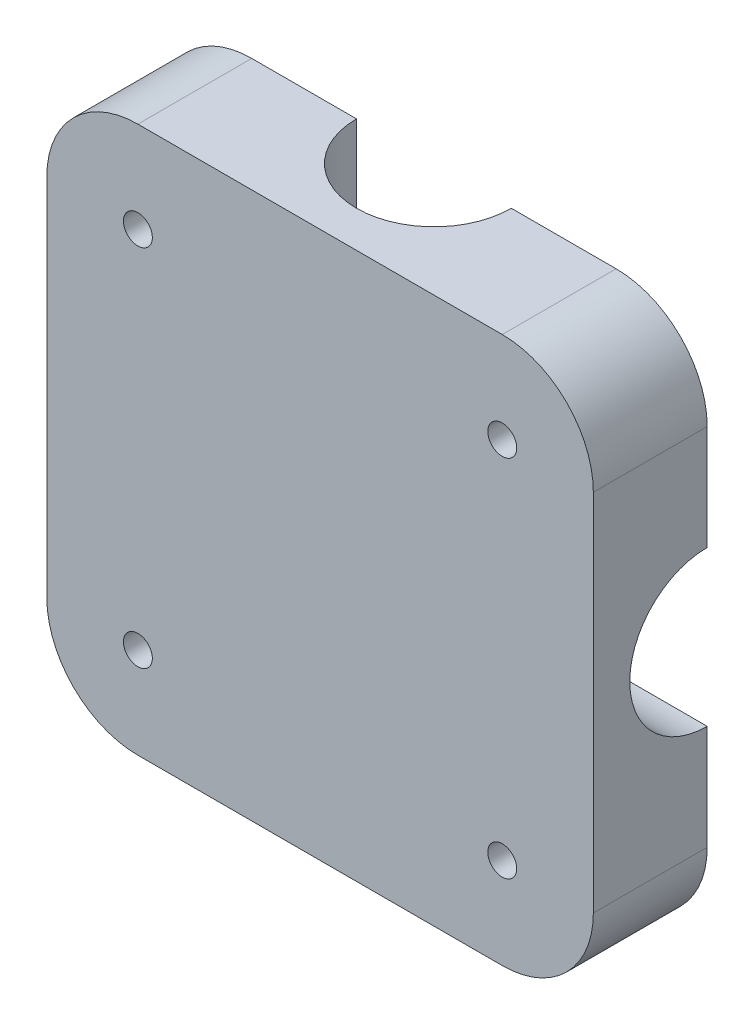
ISO-10303-21;
HEADER;
FILE_DESCRIPTION(('STEP AP214'),'2;1');
FILE_NAME('part.step','',(''),(''),'','','');
FILE_SCHEMA(('AUTOMOTIVE_DESIGN { 1 0 10303 214 1 1 1 1 }'));
ENDSEC;
DATA;
#1=APPLICATION_CONTEXT('core data for automotive mechanical design processes');
#2=APPLICATION_PROTOCOL_DEFINITION('international standard','automotive_design',2000,#1);
#3=PRODUCT_CONTEXT('',#1,'mechanical');
#4=PRODUCT('Part','Part','',(#3));
#5=PRODUCT_RELATED_PRODUCT_CATEGORY('part','',(#4));
#6=PRODUCT_DEFINITION_FORMATION('','',#4);
#7=PRODUCT_DEFINITION_CONTEXT('part definition',#1,'design');
#8=PRODUCT_DEFINITION('design','',#6,#7);
#9=PRODUCT_DEFINITION_SHAPE('','',#8);
#10=(LENGTH_UNIT() NAMED_UNIT(*) SI_UNIT(.MILLI.,.METRE.));
#11=(NAMED_UNIT(*) PLANE_ANGLE_UNIT() SI_UNIT($,.RADIAN.));
#12=(NAMED_UNIT(*) SI_UNIT($,.STERADIAN.) SOLID_ANGLE_UNIT());
#13=UNCERTAINTY_MEASURE_WITH_UNIT(LENGTH_MEASURE(1.E-05),#10,'distance_accuracy_value','');
#14=(GEOMETRIC_REPRESENTATION_CONTEXT(3) GLOBAL_UNCERTAINTY_ASSIGNED_CONTEXT((#13)) GLOBAL_UNIT_ASSIGNED_CONTEXT((#10,
#11,#12)) REPRESENTATION_CONTEXT('',''));
#15=CARTESIAN_POINT('',(0.,0.,0.));
#16=DIRECTION('',(0.,0.,1.));
#17=DIRECTION('',(1.,0.,0.));
#18=AXIS2_PLACEMENT_3D('',#15,#16,#17);
#19=CARTESIAN_POINT('',(20.,20.,0.));
#20=DIRECTION('',(0.,0.,-1.));
#21=DIRECTION('',(-1.,0.,0.));
#22=AXIS2_PLACEMENT_3D('',#19,#20,#21);
#23=PLANE('',#22);
#24=CARTESIAN_POINT('',(-19.9999999999996,-20.,0.));
#25=DIRECTION('',(0.,0.,-1.));
#26=DIRECTION('',(-1.,0.,0.));
#27=AXIS2_PLACEMENT_3D('',#24,#25,#26);
#28=CIRCLE('',#27,1.5875);
#29=CARTESIAN_POINT('',(-21.5874999999996,-20.,0.));
#30=VERTEX_POINT('',#29);
#31=EDGE_CURVE('E148',#30,#30,#28,.T.);
#32=ORIENTED_EDGE('',*,*,#31,.F.);
#33=EDGE_LOOP('',(#32));
#34=FACE_BOUND('',#33,.T.);
#35=DIRECTION('',(-1.,0.,0.));
#36=VECTOR('',#35,1.);
#37=CARTESIAN_POINT('',(52.5,-8.5,0.));
#38=LINE('',#37,#36);
#39=CARTESIAN_POINT('',(-8.5,-8.5,0.));
#40=VERTEX_POINT('',#39);
#41=CARTESIAN_POINT('',(-30.,-8.5,0.));
#42=VERTEX_POINT('',#41);
#43=EDGE_CURVE('E143',#40,#42,#38,.T.);
#44=ORIENTED_EDGE('',*,*,#43,.F.);
#45=DIRECTION('',(0.,1.,0.));
#46=VECTOR('',#45,1.);
#47=CARTESIAN_POINT('',(-8.5,-41.25,0.));
#48=LINE('',#47,#46);
#49=CARTESIAN_POINT('',(-8.5,-30.,0.));
#50=VERTEX_POINT('',#49);
#51=EDGE_CURVE('E211',#50,#40,#48,.T.);
#52=ORIENTED_EDGE('',*,*,#51,.F.);
#53=DIRECTION('',(1.,0.,0.));
#54=VECTOR('',#53,1.);
#55=CARTESIAN_POINT('',(-19.9999999999999,-30.,0.));
#56=LINE('',#55,#54);
#57=CARTESIAN_POINT('',(-19.9999999999999,-30.,0.));
#58=VERTEX_POINT('',#57);
#59=EDGE_CURVE('E175',#58,#50,#56,.T.);
#60=ORIENTED_EDGE('',*,*,#59,.F.);
#61=CARTESIAN_POINT('',(-20.,-20.,0.));
#62=DIRECTION('',(0.,0.,1.));
#63=DIRECTION('',(-1.,0.,0.));
#64=AXIS2_PLACEMENT_3D('',#61,#62,#63);
#65=CIRCLE('',#64,10.);
#66=CARTESIAN_POINT('',(-30.,-19.9999999999999,0.));
#67=VERTEX_POINT('',#66);
#68=EDGE_CURVE('E166',#67,#58,#65,.T.);
#69=ORIENTED_EDGE('',*,*,#68,.F.);
#70=DIRECTION('',(0.,-1.,0.));
#71=VECTOR('',#70,1.);
#72=CARTESIAN_POINT('',(-30.,-19.9999999999999,0.));
#73=LINE('',#72,#71);
#74=EDGE_CURVE('E167',#42,#67,#73,.T.);
#75=ORIENTED_EDGE('',*,*,#74,.F.);
#76=EDGE_LOOP('',(#44,#52,#60,#69,#75));
#77=FACE_BOUND('',#76,.T.);
#78=ADVANCED_FACE('F35',(#34,#77),#23,.T.);
#79=CARTESIAN_POINT('',(20.0000000000004,-19.9999999999994,0.));
#80=DIRECTION('',(0.,0.,-1.));
#81=DIRECTION('',(-1.,0.,0.));
#82=AXIS2_PLACEMENT_3D('',#79,#80,#81);
#83=CIRCLE('',#82,1.5875);
#84=CARTESIAN_POINT('',(18.4125000000004,-19.9999999999994,0.));
#85=VERTEX_POINT('',#84);
#86=EDGE_CURVE('E284',#85,#85,#83,.T.);
#87=ORIENTED_EDGE('',*,*,#86,.F.);
#88=EDGE_LOOP('',(#87));
#89=FACE_BOUND('',#88,.T.);
#90=DIRECTION('',(-1.,0.,0.));
#91=VECTOR('',#90,1.);
#92=CARTESIAN_POINT('',(52.5,-8.5,0.));
#93=LINE('',#92,#91);
#94=CARTESIAN_POINT('',(30.,-8.5,0.));
#95=VERTEX_POINT('',#94);
#96=CARTESIAN_POINT('',(8.5,-8.5,0.));
#97=VERTEX_POINT('',#96);
#98=EDGE_CURVE('E147',#95,#97,#93,.T.);
#99=ORIENTED_EDGE('',*,*,#98,.F.);
#100=DIRECTION('',(0.,1.,0.));
#101=VECTOR('',#100,1.);
#102=CARTESIAN_POINT('',(30.,-19.9999999999999,0.));
#103=LINE('',#102,#101);
#104=CARTESIAN_POINT('',(30.,-20.,0.));
#105=VERTEX_POINT('',#104);
#106=EDGE_CURVE('E181',#105,#95,#103,.T.);
#107=ORIENTED_EDGE('',*,*,#106,.F.);
#108=CARTESIAN_POINT('',(20.,-20.,0.));
#109=DIRECTION('',(0.,0.,1.));
#110=DIRECTION('',(1.,0.,0.));
#111=AXIS2_PLACEMENT_3D('',#108,#109,#110);
#112=CIRCLE('',#111,10.);
#113=CARTESIAN_POINT('',(19.9999999999999,-30.,0.));
#114=VERTEX_POINT('',#113);
#115=EDGE_CURVE('E178',#114,#105,#112,.T.);
#116=ORIENTED_EDGE('',*,*,#115,.F.);
#117=CARTESIAN_POINT('',(8.5,-30.,0.));
#118=VERTEX_POINT('',#117);
#119=EDGE_CURVE('E169',#118,#114,#56,.T.);
#120=ORIENTED_EDGE('',*,*,#119,.F.);
#121=DIRECTION('',(0.,1.,0.));
#122=VECTOR('',#121,1.);
#123=CARTESIAN_POINT('',(8.5,-41.25,0.));
#124=LINE('',#123,#122);
#125=EDGE_CURVE('E208',#97,#118,#124,.F.);
#126=ORIENTED_EDGE('',*,*,#125,.F.);
#127=EDGE_LOOP('',(#99,#107,#116,#120,#126));
#128=FACE_BOUND('',#127,.T.);
#129=ADVANCED_FACE('F329',(#89,#128),#23,.T.);
#130=CARTESIAN_POINT('',(0.,-41.25,0.));
#131=DIRECTION('',(0.,1.,0.));
#132=DIRECTION('',(0.,0.,1.));
#133=AXIS2_PLACEMENT_3D('',#130,#131,#132);
#134=CYLINDRICAL_SURFACE('',#133,8.5);
#135=CARTESIAN_POINT('',(8.49999999999999,30.,0.));
#136=VERTEX_POINT('',#135);
#137=CARTESIAN_POINT('',(8.49999999999999,8.5,0.));
#138=VERTEX_POINT('',#137);
#139=EDGE_CURVE('E209',#136,#138,#124,.F.);
#140=ORIENTED_EDGE('',*,*,#139,.T.);
#141=CARTESIAN_POINT('',(0.,0.,0.));
#142=DIRECTION('',(-0.707106781186547,0.707106781186547,0.));
#143=DIRECTION('',(0.707106781186547,0.707106781186547,0.));
#144=AXIS2_PLACEMENT_3D('',#141,#142,#143);
#145=ELLIPSE('',#144,12.0208152801713,8.5);
#146=CARTESIAN_POINT('',(0.,0.,8.5));
#147=VERTEX_POINT('',#146);
#148=EDGE_CURVE('E11',#138,#147,#145,.F.);
#149=ORIENTED_EDGE('',*,*,#148,.T.);
#150=CARTESIAN_POINT('',(0.,0.,0.));
#151=DIRECTION('',(0.707106781186547,0.707106781186547,0.));
#152=DIRECTION('',(-0.707106781186547,0.707106781186547,0.));
#153=AXIS2_PLACEMENT_3D('',#150,#151,#152);
#154=ELLIPSE('',#153,12.0208152801713,8.5);
#155=CARTESIAN_POINT('',(-8.5,8.5,0.));
#156=VERTEX_POINT('',#155);
#157=EDGE_CURVE('E214',#147,#156,#154,.F.);
#158=ORIENTED_EDGE('',*,*,#157,.T.);
#159=CARTESIAN_POINT('',(-8.5,30.,0.));
#160=VERTEX_POINT('',#159);
#161=EDGE_CURVE('E157',#156,#160,#48,.T.);
#162=ORIENTED_EDGE('',*,*,#161,.T.);
#163=CARTESIAN_POINT('',(0.,30.,0.));
#164=DIRECTION('',(0.,-1.,0.));
#165=DIRECTION('',(0.,0.,-1.));
#166=AXIS2_PLACEMENT_3D('',#163,#164,#165);
#167=CIRCLE('',#166,8.5);
#168=EDGE_CURVE('E59',#136,#160,#167,.T.);
#169=ORIENTED_EDGE('',*,*,#168,.F.);
#170=EDGE_LOOP('',(#140,#149,#158,#162,#169));
#171=FACE_BOUND('',#170,.T.);
#172=ADVANCED_FACE('F272',(#171),#134,.F.);
#173=CARTESIAN_POINT('',(-20.,20.,0.));
#174=DIRECTION('',(0.,0.,-1.));
#175=DIRECTION('',(-1.,0.,0.));
#176=AXIS2_PLACEMENT_3D('',#173,#174,#175);
#177=CIRCLE('',#176,1.5875);
#178=CARTESIAN_POINT('',(-21.5875,20.,0.));
#179=VERTEX_POINT('',#178);
#180=EDGE_CURVE('E287',#179,#179,#177,.T.);
#181=ORIENTED_EDGE('',*,*,#180,.F.);
#182=EDGE_LOOP('',(#181));
#183=FACE_BOUND('',#182,.T.);
#184=DIRECTION('',(-1.,0.,0.));
#185=VECTOR('',#184,1.);
#186=CARTESIAN_POINT('',(52.5,8.5,0.));
#187=LINE('',#186,#185);
#188=CARTESIAN_POINT('',(-30.,8.5,0.));
#189=VERTEX_POINT('',#188);
#190=EDGE_CURVE('E51',#189,#156,#187,.F.);
#191=ORIENTED_EDGE('',*,*,#190,.F.);
#192=CARTESIAN_POINT('',(-30.,19.9999999999999,0.));
#193=VERTEX_POINT('',#192);
#194=EDGE_CURVE('E155',#193,#189,#73,.T.);
#195=ORIENTED_EDGE('',*,*,#194,.F.);
#196=CARTESIAN_POINT('',(-20.,20.,0.));
#197=DIRECTION('',(0.,0.,1.));
#198=DIRECTION('',(-1.,0.,0.));
#199=AXIS2_PLACEMENT_3D('',#196,#197,#198);
#200=CIRCLE('',#199,10.);
#201=CARTESIAN_POINT('',(-19.9999999999999,30.,0.));
#202=VERTEX_POINT('',#201);
#203=EDGE_CURVE('E171',#202,#193,#200,.T.);
#204=ORIENTED_EDGE('',*,*,#203,.F.);
#205=DIRECTION('',(-1.,0.,0.));
#206=VECTOR('',#205,1.);
#207=CARTESIAN_POINT('',(-19.9999999999999,30.,0.));
#208=LINE('',#207,#206);
#209=EDGE_CURVE('E251',#160,#202,#208,.T.);
#210=ORIENTED_EDGE('',*,*,#209,.F.);
#211=ORIENTED_EDGE('',*,*,#161,.F.);
#212=EDGE_LOOP('',(#191,#195,#204,#210,#211));
#213=FACE_BOUND('',#212,.T.);
#214=ADVANCED_FACE('F153',(#183,#213),#23,.T.);
#215=CARTESIAN_POINT('',(20.,20.,12.5));
#216=DIRECTION('',(0.,0.,-1.));
#217=DIRECTION('',(-1.,0.,0.));
#218=AXIS2_PLACEMENT_3D('',#215,#216,#217);
#219=CYLINDRICAL_SURFACE('',#218,10.);
#220=CARTESIAN_POINT('',(20.,20.,0.));
#221=DIRECTION('',(0.,0.,1.));
#222=DIRECTION('',(-1.,0.,0.));
#223=AXIS2_PLACEMENT_3D('',#220,#221,#222);
#224=CIRCLE('',#223,10.);
#225=CARTESIAN_POINT('',(30.,19.9999999999999,0.));
#226=VERTEX_POINT('',#225);
#227=CARTESIAN_POINT('',(19.9999999999999,30.,0.));
#228=VERTEX_POINT('',#227);
#229=EDGE_CURVE('E234',#226,#228,#224,.T.);
#230=ORIENTED_EDGE('',*,*,#229,.T.);
#231=DIRECTION('',(0.,0.,-1.));
#232=VECTOR('',#231,1.);
#233=CARTESIAN_POINT('',(19.9999999999999,30.,12.5));
#234=LINE('',#233,#232);
#235=CARTESIAN_POINT('',(19.9999999999999,30.,12.5));
#236=VERTEX_POINT('',#235);
#237=EDGE_CURVE('E205',#236,#228,#234,.T.);
#238=ORIENTED_EDGE('',*,*,#237,.F.);
#239=CARTESIAN_POINT('',(20.,20.,12.5));
#240=DIRECTION('',(0.,0.,1.));
#241=DIRECTION('',(-1.,0.,0.));
#242=AXIS2_PLACEMENT_3D('',#239,#240,#241);
#243=CIRCLE('',#242,10.);
#244=CARTESIAN_POINT('',(30.,19.9999999999999,12.5));
#245=VERTEX_POINT('',#244);
#246=EDGE_CURVE('E184',#245,#236,#243,.T.);
#247=ORIENTED_EDGE('',*,*,#246,.F.);
#248=DIRECTION('',(0.,0.,-1.));
#249=VECTOR('',#248,1.);
#250=CARTESIAN_POINT('',(30.,19.9999999999999,12.5));
#251=LINE('',#250,#249);
#252=EDGE_CURVE('E185',#245,#226,#251,.T.);
#253=ORIENTED_EDGE('',*,*,#252,.T.);
#254=EDGE_LOOP('',(#230,#238,#247,#253));
#255=FACE_BOUND('',#254,.T.);
#256=ADVANCED_FACE('F37',(#255),#219,.T.);
#257=CARTESIAN_POINT('',(-19.9999999999999,30.,12.5));
#258=DIRECTION('',(0.,-1.,0.));
#259=DIRECTION('',(0.,0.,-1.));
#260=AXIS2_PLACEMENT_3D('',#257,#258,#259);
#261=PLANE('',#260);
#262=EDGE_CURVE('E252',#228,#136,#208,.T.);
#263=ORIENTED_EDGE('',*,*,#262,.T.);
#264=ORIENTED_EDGE('',*,*,#168,.T.);
#265=ORIENTED_EDGE('',*,*,#209,.T.);
#266=DIRECTION('',(0.,0.,-1.));
#267=VECTOR('',#266,1.);
#268=CARTESIAN_POINT('',(-19.9999999999999,30.,12.5));
#269=LINE('',#268,#267);
#270=CARTESIAN_POINT('',(-19.9999999999999,30.,12.5));
#271=VERTEX_POINT('',#270);
#272=EDGE_CURVE('E202',#271,#202,#269,.T.);
#273=ORIENTED_EDGE('',*,*,#272,.F.);
#274=DIRECTION('',(-1.,0.,0.));
#275=VECTOR('',#274,1.);
#276=CARTESIAN_POINT('',(-19.9999999999999,30.,12.5));
#277=LINE('',#276,#275);
#278=EDGE_CURVE('E237',#236,#271,#277,.T.);
#279=ORIENTED_EDGE('',*,*,#278,.F.);
#280=ORIENTED_EDGE('',*,*,#237,.T.);
#281=EDGE_LOOP('',(#263,#264,#265,#273,#279,#280));
#282=FACE_BOUND('',#281,.T.);
#283=ADVANCED_FACE('F256',(#282),#261,.F.);
#284=CARTESIAN_POINT('',(-20.,20.,12.5));
#285=DIRECTION('',(0.,0.,-1.));
#286=DIRECTION('',(-1.,0.,0.));
#287=AXIS2_PLACEMENT_3D('',#284,#285,#286);
#288=CYLINDRICAL_SURFACE('',#287,10.);
#289=ORIENTED_EDGE('',*,*,#203,.T.);
#290=DIRECTION('',(0.,0.,-1.));
#291=VECTOR('',#290,1.);
#292=CARTESIAN_POINT('',(-30.,19.9999999999999,12.5));
#293=LINE('',#292,#291);
#294=CARTESIAN_POINT('',(-30.,19.9999999999999,12.5));
#295=VERTEX_POINT('',#294);
#296=EDGE_CURVE('E165',#295,#193,#293,.T.);
#297=ORIENTED_EDGE('',*,*,#296,.F.);
#298=CARTESIAN_POINT('',(-20.,20.,12.5));
#299=DIRECTION('',(0.,0.,1.));
#300=DIRECTION('',(-1.,0.,0.));
#301=AXIS2_PLACEMENT_3D('',#298,#299,#300);
#302=CIRCLE('',#301,10.);
#303=EDGE_CURVE('E239',#271,#295,#302,.T.);
#304=ORIENTED_EDGE('',*,*,#303,.F.);
#305=ORIENTED_EDGE('',*,*,#272,.T.);
#306=EDGE_LOOP('',(#289,#297,#304,#305));
#307=FACE_BOUND('',#306,.T.);
#308=ADVANCED_FACE('F259',(#307),#288,.T.);
#309=CARTESIAN_POINT('',(-30.,-19.9999999999999,12.5));
#310=DIRECTION('',(1.,0.,0.));
#311=DIRECTION('',(0.,0.,-1.));
#312=AXIS2_PLACEMENT_3D('',#309,#310,#311);
#313=PLANE('',#312);
#314=ORIENTED_EDGE('',*,*,#194,.T.);
#315=CARTESIAN_POINT('',(-30.,0.,0.));
#316=DIRECTION('',(-1.,0.,0.));
#317=DIRECTION('',(0.,0.,1.));
#318=AXIS2_PLACEMENT_3D('',#315,#316,#317);
#319=CIRCLE('',#318,8.5);
#320=EDGE_CURVE('E140',#42,#189,#319,.T.);
#321=ORIENTED_EDGE('',*,*,#320,.F.);
#322=ORIENTED_EDGE('',*,*,#74,.T.);
#323=DIRECTION('',(0.,0.,-1.));
#324=VECTOR('',#323,1.);
#325=CARTESIAN_POINT('',(-30.,-19.9999999999999,12.5));
#326=LINE('',#325,#324);
#327=CARTESIAN_POINT('',(-30.,-19.9999999999999,12.5));
#328=VERTEX_POINT('',#327);
#329=EDGE_CURVE('E198',#328,#67,#326,.T.);
#330=ORIENTED_EDGE('',*,*,#329,.F.);
#331=DIRECTION('',(0.,-1.,0.));
#332=VECTOR('',#331,1.);
#333=CARTESIAN_POINT('',(-30.,-19.9999999999999,12.5));
#334=LINE('',#333,#332);
#335=EDGE_CURVE('E241',#295,#328,#334,.T.);
#336=ORIENTED_EDGE('',*,*,#335,.F.);
#337=ORIENTED_EDGE('',*,*,#296,.T.);
#338=EDGE_LOOP('',(#314,#321,#322,#330,#336,#337));
#339=FACE_BOUND('',#338,.T.);
#340=ADVANCED_FACE('F162',(#339),#313,.F.);
#341=CARTESIAN_POINT('',(-20.,-20.,12.5));
#342=DIRECTION('',(0.,0.,-1.));
#343=DIRECTION('',(-1.,0.,0.));
#344=AXIS2_PLACEMENT_3D('',#341,#342,#343);
#345=CYLINDRICAL_SURFACE('',#344,10.);
#346=ORIENTED_EDGE('',*,*,#68,.T.);
#347=DIRECTION('',(0.,0.,-1.));
#348=VECTOR('',#347,1.);
#349=CARTESIAN_POINT('',(-19.9999999999999,-30.,12.5));
#350=LINE('',#349,#348);
#351=CARTESIAN_POINT('',(-19.9999999999999,-30.,12.5));
#352=VERTEX_POINT('',#351);
#353=EDGE_CURVE('E195',#352,#58,#350,.T.);
#354=ORIENTED_EDGE('',*,*,#353,.F.);
#355=CARTESIAN_POINT('',(-20.,-20.,12.5));
#356=DIRECTION('',(0.,0.,1.));
#357=DIRECTION('',(-1.,0.,0.));
#358=AXIS2_PLACEMENT_3D('',#355,#356,#357);
#359=CIRCLE('',#358,10.);
#360=EDGE_CURVE('E243',#328,#352,#359,.T.);
#361=ORIENTED_EDGE('',*,*,#360,.F.);
#362=ORIENTED_EDGE('',*,*,#329,.T.);
#363=EDGE_LOOP('',(#346,#354,#361,#362));
#364=FACE_BOUND('',#363,.T.);
#365=ADVANCED_FACE('F443',(#364),#345,.T.);
#366=CARTESIAN_POINT('',(-19.9999999999999,-30.,12.5));
#367=DIRECTION('',(0.,1.,0.));
#368=DIRECTION('',(0.,0.,1.));
#369=AXIS2_PLACEMENT_3D('',#366,#367,#368);
#370=PLANE('',#369);
#371=ORIENTED_EDGE('',*,*,#59,.T.);
#372=CARTESIAN_POINT('',(0.,-30.,0.));
#373=DIRECTION('',(0.,1.,0.));
#374=DIRECTION('',(0.,0.,1.));
#375=AXIS2_PLACEMENT_3D('',#372,#373,#374);
#376=CIRCLE('',#375,8.5);
#377=EDGE_CURVE('E227',#50,#118,#376,.T.);
#378=ORIENTED_EDGE('',*,*,#377,.T.);
#379=ORIENTED_EDGE('',*,*,#119,.T.);
#380=DIRECTION('',(0.,0.,-1.));
#381=VECTOR('',#380,1.);
#382=CARTESIAN_POINT('',(19.9999999999999,-30.,12.5));
#383=LINE('',#382,#381);
#384=CARTESIAN_POINT('',(19.9999999999999,-30.,12.5));
#385=VERTEX_POINT('',#384);
#386=EDGE_CURVE('E192',#385,#114,#383,.T.);
#387=ORIENTED_EDGE('',*,*,#386,.F.);
#388=DIRECTION('',(1.,0.,0.));
#389=VECTOR('',#388,1.);
#390=CARTESIAN_POINT('',(-19.9999999999999,-30.,12.5));
#391=LINE('',#390,#389);
#392=EDGE_CURVE('E245',#352,#385,#391,.T.);
#393=ORIENTED_EDGE('',*,*,#392,.F.);
#394=ORIENTED_EDGE('',*,*,#353,.T.);
#395=EDGE_LOOP('',(#371,#378,#379,#387,#393,#394));
#396=FACE_BOUND('',#395,.T.);
#397=ADVANCED_FACE('F456',(#396),#370,.F.);
#398=CARTESIAN_POINT('',(20.,-20.,12.5));
#399=DIRECTION('',(0.,0.,-1.));
#400=DIRECTION('',(-1.,0.,0.));
#401=AXIS2_PLACEMENT_3D('',#398,#399,#400);
#402=CYLINDRICAL_SURFACE('',#401,10.);
#403=ORIENTED_EDGE('',*,*,#115,.T.);
#404=DIRECTION('',(0.,0.,-1.));
#405=VECTOR('',#404,1.);
#406=CARTESIAN_POINT('',(30.,-20.,12.5));
#407=LINE('',#406,#405);
#408=CARTESIAN_POINT('',(30.,-20.,12.5));
#409=VERTEX_POINT('',#408);
#410=EDGE_CURVE('E188',#409,#105,#407,.T.);
#411=ORIENTED_EDGE('',*,*,#410,.F.);
#412=CARTESIAN_POINT('',(20.,-20.,12.5));
#413=DIRECTION('',(0.,0.,1.));
#414=DIRECTION('',(1.,0.,0.));
#415=AXIS2_PLACEMENT_3D('',#412,#413,#414);
#416=CIRCLE('',#415,10.);
#417=EDGE_CURVE('E247',#385,#409,#416,.T.);
#418=ORIENTED_EDGE('',*,*,#417,.F.);
#419=ORIENTED_EDGE('',*,*,#386,.T.);
#420=EDGE_LOOP('',(#403,#411,#418,#419));
#421=FACE_BOUND('',#420,.T.);
#422=ADVANCED_FACE('F433',(#421),#402,.T.);
#423=CARTESIAN_POINT('',(30.,-19.9999999999999,12.5));
#424=DIRECTION('',(-1.,0.,0.));
#425=DIRECTION('',(0.,0.,1.));
#426=AXIS2_PLACEMENT_3D('',#423,#424,#425);
#427=PLANE('',#426);
#428=ORIENTED_EDGE('',*,*,#106,.T.);
#429=CARTESIAN_POINT('',(30.,0.,0.));
#430=DIRECTION('',(-1.,0.,0.));
#431=DIRECTION('',(0.,0.,1.));
#432=AXIS2_PLACEMENT_3D('',#429,#430,#431);
#433=CIRCLE('',#432,8.5);
#434=CARTESIAN_POINT('',(30.,8.5,0.));
#435=VERTEX_POINT('',#434);
#436=EDGE_CURVE('E159',#95,#435,#433,.T.);
#437=ORIENTED_EDGE('',*,*,#436,.T.);
#438=EDGE_CURVE('E180',#435,#226,#103,.T.);
#439=ORIENTED_EDGE('',*,*,#438,.T.);
#440=ORIENTED_EDGE('',*,*,#252,.F.);
#441=DIRECTION('',(0.,1.,0.));
#442=VECTOR('',#441,1.);
#443=CARTESIAN_POINT('',(30.,-19.9999999999999,12.5));
#444=LINE('',#443,#442);
#445=EDGE_CURVE('E189',#409,#245,#444,.T.);
#446=ORIENTED_EDGE('',*,*,#445,.F.);
#447=ORIENTED_EDGE('',*,*,#410,.T.);
#448=EDGE_LOOP('',(#428,#437,#439,#440,#446,#447));
#449=FACE_BOUND('',#448,.T.);
#450=ADVANCED_FACE('F307',(#449),#427,.F.);
#451=CARTESIAN_POINT('',(20.,20.,12.5));
#452=DIRECTION('',(0.,0.,-1.));
#453=DIRECTION('',(-1.,0.,0.));
#454=AXIS2_PLACEMENT_3D('',#451,#452,#453);
#455=PLANE('',#454);
#456=CARTESIAN_POINT('',(-19.9999999999996,-20.,12.5));
#457=DIRECTION('',(0.,0.,1.));
#458=DIRECTION('',(1.,0.,0.));
#459=AXIS2_PLACEMENT_3D('',#456,#457,#458);
#460=CIRCLE('',#459,1.5875);
#461=CARTESIAN_POINT('',(-18.4124999999996,-20.,12.5));
#462=VERTEX_POINT('',#461);
#463=EDGE_CURVE('E294',#462,#462,#460,.T.);
#464=ORIENTED_EDGE('',*,*,#463,.F.);
#465=EDGE_LOOP('',(#464));
#466=FACE_BOUND('',#465,.T.);
#467=CARTESIAN_POINT('',(20.0000000000004,-19.9999999999994,12.5));
#468=DIRECTION('',(0.,0.,1.));
#469=DIRECTION('',(1.,0.,0.));
#470=AXIS2_PLACEMENT_3D('',#467,#468,#469);
#471=CIRCLE('',#470,1.5875);
#472=CARTESIAN_POINT('',(21.5875000000004,-19.9999999999994,12.5));
#473=VERTEX_POINT('',#472);
#474=EDGE_CURVE('E297',#473,#473,#471,.T.);
#475=ORIENTED_EDGE('',*,*,#474,.F.);
#476=EDGE_LOOP('',(#475));
#477=FACE_BOUND('',#476,.T.);
#478=CARTESIAN_POINT('',(20.,20.0000000000006,12.5));
#479=DIRECTION('',(0.,0.,1.));
#480=DIRECTION('',(1.,0.,0.));
#481=AXIS2_PLACEMENT_3D('',#478,#479,#480);
#482=CIRCLE('',#481,1.5875);
#483=CARTESIAN_POINT('',(21.5875,20.0000000000006,12.5));
#484=VERTEX_POINT('',#483);
#485=EDGE_CURVE('E293',#484,#484,#482,.T.);
#486=ORIENTED_EDGE('',*,*,#485,.F.);
#487=EDGE_LOOP('',(#486));
#488=FACE_BOUND('',#487,.T.);
#489=CARTESIAN_POINT('',(-20.,20.,12.5));
#490=DIRECTION('',(0.,0.,1.));
#491=DIRECTION('',(1.,0.,0.));
#492=AXIS2_PLACEMENT_3D('',#489,#490,#491);
#493=CIRCLE('',#492,1.5875);
#494=CARTESIAN_POINT('',(-18.4125,20.,12.5));
#495=VERTEX_POINT('',#494);
#496=EDGE_CURVE('E290',#495,#495,#493,.T.);
#497=ORIENTED_EDGE('',*,*,#496,.F.);
#498=EDGE_LOOP('',(#497));
#499=FACE_BOUND('',#498,.T.);
#500=ORIENTED_EDGE('',*,*,#246,.T.);
#501=ORIENTED_EDGE('',*,*,#278,.T.);
#502=ORIENTED_EDGE('',*,*,#303,.T.);
#503=ORIENTED_EDGE('',*,*,#335,.T.);
#504=ORIENTED_EDGE('',*,*,#360,.T.);
#505=ORIENTED_EDGE('',*,*,#392,.T.);
#506=ORIENTED_EDGE('',*,*,#417,.T.);
#507=ORIENTED_EDGE('',*,*,#445,.T.);
#508=EDGE_LOOP('',(#500,#501,#502,#503,#504,#505,#506,#507));
#509=FACE_BOUND('',#508,.T.);
#510=ADVANCED_FACE('F261',(#466,#477,#488,#499,#509),#455,.F.);
#511=CARTESIAN_POINT('',(20.,20.0000000000006,0.));
#512=DIRECTION('',(0.,0.,-1.));
#513=DIRECTION('',(-1.,0.,0.));
#514=AXIS2_PLACEMENT_3D('',#511,#512,#513);
#515=CIRCLE('',#514,1.5875);
#516=CARTESIAN_POINT('',(18.4125,20.0000000000006,0.));
#517=VERTEX_POINT('',#516);
#518=EDGE_CURVE('E39',#517,#517,#515,.T.);
#519=ORIENTED_EDGE('',*,*,#518,.F.);
#520=EDGE_LOOP('',(#519));
#521=FACE_BOUND('',#520,.T.);
#522=DIRECTION('',(-1.,0.,0.));
#523=VECTOR('',#522,1.);
#524=CARTESIAN_POINT('',(52.5,8.5,0.));
#525=LINE('',#524,#523);
#526=EDGE_CURVE('E158',#138,#435,#525,.F.);
#527=ORIENTED_EDGE('',*,*,#526,.F.);
#528=ORIENTED_EDGE('',*,*,#139,.F.);
#529=ORIENTED_EDGE('',*,*,#262,.F.);
#530=ORIENTED_EDGE('',*,*,#229,.F.);
#531=ORIENTED_EDGE('',*,*,#438,.F.);
#532=EDGE_LOOP('',(#527,#528,#529,#530,#531));
#533=FACE_BOUND('',#532,.T.);
#534=ADVANCED_FACE('F271',(#521,#533),#23,.T.);
#535=ORIENTED_EDGE('',*,*,#51,.T.);
#536=CARTESIAN_POINT('',(0.,0.,0.));
#537=DIRECTION('',(-0.707106781186547,0.707106781186547,0.));
#538=DIRECTION('',(0.707106781186547,0.707106781186547,0.));
#539=AXIS2_PLACEMENT_3D('',#536,#537,#538);
#540=ELLIPSE('',#539,12.0208152801713,8.5);
#541=EDGE_CURVE('E44',#40,#147,#540,.T.);
#542=ORIENTED_EDGE('',*,*,#541,.T.);
#543=CARTESIAN_POINT('',(0.,0.,0.));
#544=DIRECTION('',(0.707106781186547,0.707106781186547,0.));
#545=DIRECTION('',(-0.707106781186547,0.707106781186547,0.));
#546=AXIS2_PLACEMENT_3D('',#543,#544,#545);
#547=ELLIPSE('',#546,12.0208152801713,8.5);
#548=EDGE_CURVE('E216',#147,#97,#547,.T.);
#549=ORIENTED_EDGE('',*,*,#548,.T.);
#550=ORIENTED_EDGE('',*,*,#125,.T.);
#551=ORIENTED_EDGE('',*,*,#377,.F.);
#552=EDGE_LOOP('',(#535,#542,#549,#550,#551));
#553=FACE_BOUND('',#552,.T.);
#554=ADVANCED_FACE('F221',(#553),#134,.F.);
#555=CARTESIAN_POINT('',(52.5,0.,0.));
#556=DIRECTION('',(-1.,0.,0.));
#557=DIRECTION('',(0.,0.,1.));
#558=AXIS2_PLACEMENT_3D('',#555,#556,#557);
#559=CYLINDRICAL_SURFACE('',#558,8.5);
#560=ORIENTED_EDGE('',*,*,#43,.T.);
#561=ORIENTED_EDGE('',*,*,#320,.T.);
#562=ORIENTED_EDGE('',*,*,#190,.T.);
#563=ORIENTED_EDGE('',*,*,#157,.F.);
#564=ORIENTED_EDGE('',*,*,#541,.F.);
#565=EDGE_LOOP('',(#560,#561,#562,#563,#564));
#566=FACE_BOUND('',#565,.T.);
#567=ADVANCED_FACE('F141',(#566),#559,.F.);
#568=ORIENTED_EDGE('',*,*,#526,.T.);
#569=ORIENTED_EDGE('',*,*,#436,.F.);
#570=ORIENTED_EDGE('',*,*,#98,.T.);
#571=ORIENTED_EDGE('',*,*,#548,.F.);
#572=ORIENTED_EDGE('',*,*,#148,.F.);
#573=EDGE_LOOP('',(#568,#569,#570,#571,#572));
#574=FACE_BOUND('',#573,.T.);
#575=ADVANCED_FACE('F274',(#574),#559,.F.);
#576=CARTESIAN_POINT('',(20.,20.0000000000006,-70.));
#577=DIRECTION('',(0.,0.,1.));
#578=DIRECTION('',(1.,0.,0.));
#579=AXIS2_PLACEMENT_3D('',#576,#577,#578);
#580=CYLINDRICAL_SURFACE('',#579,1.5875);
#581=ORIENTED_EDGE('',*,*,#518,.T.);
#582=EDGE_LOOP('',(#581));
#583=FACE_BOUND('',#582,.T.);
#584=ORIENTED_EDGE('',*,*,#485,.T.);
#585=EDGE_LOOP('',(#584));
#586=FACE_BOUND('',#585,.T.);
#587=ADVANCED_FACE('F303',(#583,#586),#580,.F.);
#588=CARTESIAN_POINT('',(-20.,20.,-70.));
#589=DIRECTION('',(0.,0.,1.));
#590=DIRECTION('',(1.,0.,0.));
#591=AXIS2_PLACEMENT_3D('',#588,#589,#590);
#592=CYLINDRICAL_SURFACE('',#591,1.5875);
#593=ORIENTED_EDGE('',*,*,#180,.T.);
#594=EDGE_LOOP('',(#593));
#595=FACE_BOUND('',#594,.T.);
#596=ORIENTED_EDGE('',*,*,#496,.T.);
#597=EDGE_LOOP('',(#596));
#598=FACE_BOUND('',#597,.T.);
#599=ADVANCED_FACE('F312',(#595,#598),#592,.F.);
#600=CARTESIAN_POINT('',(20.0000000000004,-19.9999999999994,-70.));
#601=DIRECTION('',(0.,0.,1.));
#602=DIRECTION('',(1.,0.,0.));
#603=AXIS2_PLACEMENT_3D('',#600,#601,#602);
#604=CYLINDRICAL_SURFACE('',#603,1.5875);
#605=ORIENTED_EDGE('',*,*,#86,.T.);
#606=EDGE_LOOP('',(#605));
#607=FACE_BOUND('',#606,.T.);
#608=ORIENTED_EDGE('',*,*,#474,.T.);
#609=EDGE_LOOP('',(#608));
#610=FACE_BOUND('',#609,.T.);
#611=ADVANCED_FACE('F314',(#607,#610),#604,.F.);
#612=CARTESIAN_POINT('',(-19.9999999999996,-20.,-70.));
#613=DIRECTION('',(0.,0.,1.));
#614=DIRECTION('',(1.,0.,0.));
#615=AXIS2_PLACEMENT_3D('',#612,#613,#614);
#616=CYLINDRICAL_SURFACE('',#615,1.5875);
#617=ORIENTED_EDGE('',*,*,#31,.T.);
#618=EDGE_LOOP('',(#617));
#619=FACE_BOUND('',#618,.T.);
#620=ORIENTED_EDGE('',*,*,#463,.T.);
#621=EDGE_LOOP('',(#620));
#622=FACE_BOUND('',#621,.T.);
#623=ADVANCED_FACE('F321',(#619,#622),#616,.F.);
#624=CLOSED_SHELL('',(#78,#129,#172,#214,#256,#283,#308,#340,#365,#397,#422,#450,#510,#534,#554,
#567,#575,#587,#599,#611,#623));
#625=MANIFOLD_SOLID_BREP('B2',#624);
#626=ADVANCED_BREP_SHAPE_REPRESENTATION('',(#18,#625),#14);
#627=SHAPE_DEFINITION_REPRESENTATION(#9,#626);
ENDSEC;
END-ISO-10303-21;
